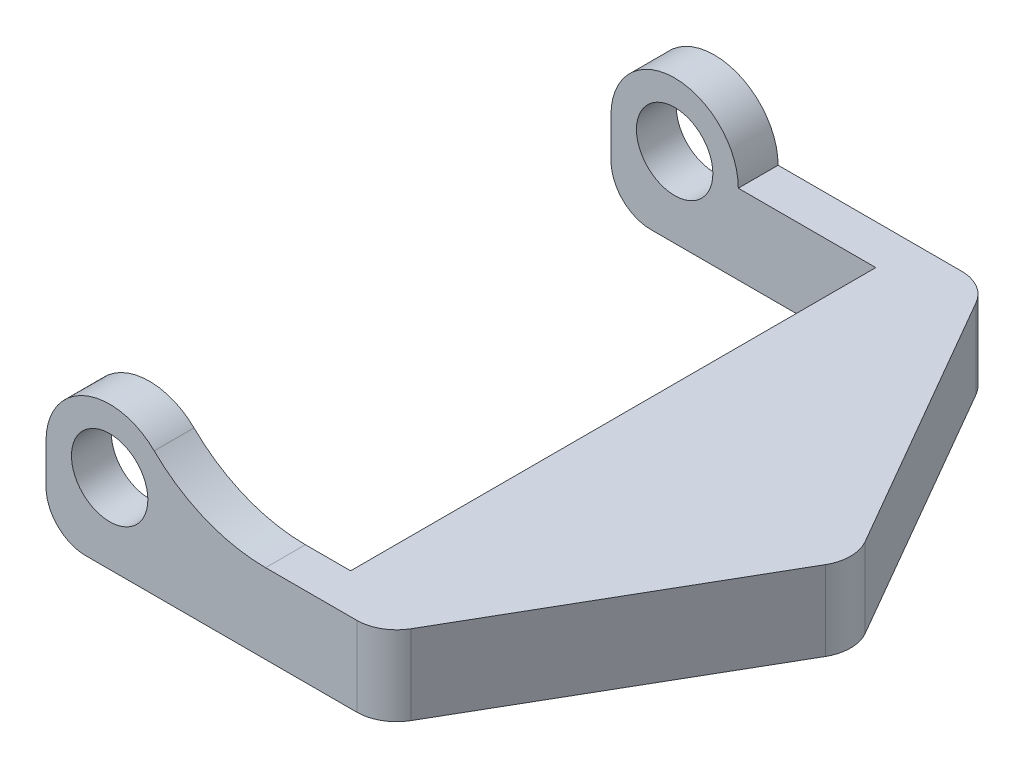
ISO-10303-21;
HEADER;
FILE_DESCRIPTION(('STEP AP214'),'2;1');
FILE_NAME('part.step','',(''),(''),'','','');
FILE_SCHEMA(('AUTOMOTIVE_DESIGN { 1 0 10303 214 1 1 1 1 }'));
ENDSEC;
DATA;
#1=APPLICATION_CONTEXT('core data for automotive mechanical design processes');
#2=APPLICATION_PROTOCOL_DEFINITION('international standard','automotive_design',2000,#1);
#3=PRODUCT_CONTEXT('',#1,'mechanical');
#4=PRODUCT('Part','Part','',(#3));
#5=PRODUCT_RELATED_PRODUCT_CATEGORY('part','',(#4));
#6=PRODUCT_DEFINITION_FORMATION('','',#4);
#7=PRODUCT_DEFINITION_CONTEXT('part definition',#1,'design');
#8=PRODUCT_DEFINITION('design','',#6,#7);
#9=PRODUCT_DEFINITION_SHAPE('','',#8);
#10=(LENGTH_UNIT() NAMED_UNIT(*) SI_UNIT(.MILLI.,.METRE.));
#11=(NAMED_UNIT(*) PLANE_ANGLE_UNIT() SI_UNIT($,.RADIAN.));
#12=(NAMED_UNIT(*) SI_UNIT($,.STERADIAN.) SOLID_ANGLE_UNIT());
#13=UNCERTAINTY_MEASURE_WITH_UNIT(LENGTH_MEASURE(1.E-05),#10,'distance_accuracy_value','');
#14=(GEOMETRIC_REPRESENTATION_CONTEXT(3) GLOBAL_UNCERTAINTY_ASSIGNED_CONTEXT((#13)) GLOBAL_UNIT_ASSIGNED_CONTEXT((#10,
#11,#12)) REPRESENTATION_CONTEXT('',''));
#15=CARTESIAN_POINT('',(0.,0.,0.));
#16=DIRECTION('',(0.,0.,1.));
#17=DIRECTION('',(1.,0.,0.));
#18=AXIS2_PLACEMENT_3D('',#15,#16,#17);
#19=CARTESIAN_POINT('',(0.,5.,0.));
#20=DIRECTION('',(0.,-1.,0.));
#21=DIRECTION('',(0.,0.,-1.));
#22=AXIS2_PLACEMENT_3D('',#19,#20,#21);
#23=PLANE('',#22);
#24=DIRECTION('',(-0.5,0.,-0.866025403784438));
#25=VECTOR('',#24,1.);
#26=CARTESIAN_POINT('',(10.9696551146029,5.,-19.));
#27=LINE('',#26,#25);
#28=CARTESIAN_POINT('',(21.2176223927188,5.,-1.25));
#29=VERTEX_POINT('',#28);
#30=CARTESIAN_POINT('',(11.6913429510899,5.,-17.75));
#31=VERTEX_POINT('',#30);
#32=EDGE_CURVE('E238',#29,#31,#27,.T.);
#33=ORIENTED_EDGE('',*,*,#32,.T.);
#34=CARTESIAN_POINT('',(9.52627944162883,5.,-16.5));
#35=DIRECTION('',(0.,-1.,0.));
#36=DIRECTION('',(0.,0.,-1.));
#37=AXIS2_PLACEMENT_3D('',#34,#35,#36);
#38=CIRCLE('',#37,2.5);
#39=CARTESIAN_POINT('',(9.52627944162883,5.,-19.));
#40=VERTEX_POINT('',#39);
#41=EDGE_CURVE('E346',#31,#40,#38,.F.);
#42=ORIENTED_EDGE('',*,*,#41,.T.);
#43=DIRECTION('',(-1.,0.,0.));
#44=VECTOR('',#43,1.);
#45=CARTESIAN_POINT('',(0.,5.,-19.));
#46=LINE('',#45,#44);
#47=CARTESIAN_POINT('',(-1.99999999999999,5.,-19.));
#48=VERTEX_POINT('',#47);
#49=EDGE_CURVE('E180',#40,#48,#46,.T.);
#50=ORIENTED_EDGE('',*,*,#49,.T.);
#51=DIRECTION('',(0.,0.,-1.));
#52=VECTOR('',#51,1.);
#53=CARTESIAN_POINT('',(-1.99999999999999,5.,-16.5));
#54=LINE('',#53,#52);
#55=CARTESIAN_POINT('',(-1.99999999999999,5.,-16.5));
#56=VERTEX_POINT('',#55);
#57=EDGE_CURVE('E195',#56,#48,#54,.T.);
#58=ORIENTED_EDGE('',*,*,#57,.F.);
#59=DIRECTION('',(1.,0.,0.));
#60=VECTOR('',#59,1.);
#61=CARTESIAN_POINT('',(6.6395280956807,5.,-16.5));
#62=LINE('',#61,#60);
#63=CARTESIAN_POINT('',(6.6395280956807,5.,-16.5));
#64=VERTEX_POINT('',#63);
#65=EDGE_CURVE('E179',#56,#64,#62,.T.);
#66=ORIENTED_EDGE('',*,*,#65,.T.);
#67=DIRECTION('',(0.,0.,1.));
#68=VECTOR('',#67,1.);
#69=CARTESIAN_POINT('',(6.6395280956807,5.,-16.5));
#70=LINE('',#69,#68);
#71=CARTESIAN_POINT('',(6.6395280956807,5.,16.5));
#72=VERTEX_POINT('',#71);
#73=EDGE_CURVE('E221',#64,#72,#70,.T.);
#74=ORIENTED_EDGE('',*,*,#73,.T.);
#75=DIRECTION('',(-1.,0.,0.));
#76=VECTOR('',#75,1.);
#77=CARTESIAN_POINT('',(6.6395280956807,5.,16.5));
#78=LINE('',#77,#76);
#79=CARTESIAN_POINT('',(3.79795897113272,5.,16.5));
#80=VERTEX_POINT('',#79);
#81=EDGE_CURVE('E224',#72,#80,#78,.T.);
#82=ORIENTED_EDGE('',*,*,#81,.T.);
#83=DIRECTION('',(0.,0.,1.));
#84=VECTOR('',#83,1.);
#85=CARTESIAN_POINT('',(3.79795897113272,5.,0.));
#86=LINE('',#85,#84);
#87=CARTESIAN_POINT('',(3.79795897113272,5.,19.));
#88=VERTEX_POINT('',#87);
#89=EDGE_CURVE('E191',#80,#88,#86,.T.);
#90=ORIENTED_EDGE('',*,*,#89,.T.);
#91=DIRECTION('',(1.,0.,0.));
#92=VECTOR('',#91,1.);
#93=CARTESIAN_POINT('',(-10.,5.,19.));
#94=LINE('',#93,#92);
#95=CARTESIAN_POINT('',(9.52627944162883,5.,19.));
#96=VERTEX_POINT('',#95);
#97=EDGE_CURVE('E232',#88,#96,#94,.T.);
#98=ORIENTED_EDGE('',*,*,#97,.T.);
#99=CARTESIAN_POINT('',(9.52627944162883,5.,16.5));
#100=DIRECTION('',(0.,-1.,0.));
#101=DIRECTION('',(0.,0.,-1.));
#102=AXIS2_PLACEMENT_3D('',#99,#100,#101);
#103=CIRCLE('',#102,2.5);
#104=CARTESIAN_POINT('',(11.6913429510899,5.,17.75));
#105=VERTEX_POINT('',#104);
#106=EDGE_CURVE('E67',#96,#105,#103,.F.);
#107=ORIENTED_EDGE('',*,*,#106,.T.);
#108=DIRECTION('',(0.5,0.,-0.866025403784438));
#109=VECTOR('',#108,1.);
#110=CARTESIAN_POINT('',(21.9393102292058,5.,0.));
#111=LINE('',#110,#109);
#112=CARTESIAN_POINT('',(21.2176223927188,5.,1.25));
#113=VERTEX_POINT('',#112);
#114=EDGE_CURVE('E235',#105,#113,#111,.T.);
#115=ORIENTED_EDGE('',*,*,#114,.T.);
#116=CARTESIAN_POINT('',(19.0525588832577,5.,0.));
#117=DIRECTION('',(0.,-1.,0.));
#118=DIRECTION('',(0.,0.,-1.));
#119=AXIS2_PLACEMENT_3D('',#116,#117,#118);
#120=CIRCLE('',#119,2.5);
#121=EDGE_CURVE('E341',#113,#29,#120,.F.);
#122=ORIENTED_EDGE('',*,*,#121,.T.);
#123=EDGE_LOOP('',(#33,#42,#50,#58,#66,#74,#82,#90,#98,#107,#115,#122));
#124=FACE_BOUND('',#123,.T.);
#125=ADVANCED_FACE('F45',(#124),#23,.F.);
#126=CARTESIAN_POINT('',(-10.,5.,-19.));
#127=DIRECTION('',(0.,0.,1.));
#128=DIRECTION('',(1.,0.,0.));
#129=AXIS2_PLACEMENT_3D('',#126,#127,#128);
#130=PLANE('',#129);
#131=CARTESIAN_POINT('',(-5.99999999999999,5.,-19.));
#132=DIRECTION('',(0.,0.,1.));
#133=DIRECTION('',(1.,0.,0.));
#134=AXIS2_PLACEMENT_3D('',#131,#132,#133);
#135=CIRCLE('',#134,2.39999999999999);
#136=CARTESIAN_POINT('',(-3.6,5.,-19.));
#137=VERTEX_POINT('',#136);
#138=EDGE_CURVE('E601',#137,#137,#135,.T.);
#139=ORIENTED_EDGE('',*,*,#138,.T.);
#140=EDGE_LOOP('',(#139));
#141=FACE_BOUND('',#140,.T.);
#142=DIRECTION('',(-1.,0.,0.));
#143=VECTOR('',#142,1.);
#144=CARTESIAN_POINT('',(-10.,0.,-19.));
#145=LINE('',#144,#143);
#146=CARTESIAN_POINT('',(9.52627944162883,0.,-19.));
#147=VERTEX_POINT('',#146);
#148=CARTESIAN_POINT('',(-7.5,0.,-19.));
#149=VERTEX_POINT('',#148);
#150=EDGE_CURVE('E213',#147,#149,#145,.T.);
#151=ORIENTED_EDGE('',*,*,#150,.T.);
#152=CARTESIAN_POINT('',(-7.5,2.5,-19.));
#153=DIRECTION('',(0.,0.,1.));
#154=DIRECTION('',(1.,0.,0.));
#155=AXIS2_PLACEMENT_3D('',#152,#153,#154);
#156=CIRCLE('',#155,2.5);
#157=CARTESIAN_POINT('',(-10.,2.5,-19.));
#158=VERTEX_POINT('',#157);
#159=EDGE_CURVE('E189',#149,#158,#156,.F.);
#160=ORIENTED_EDGE('',*,*,#159,.T.);
#161=DIRECTION('',(0.,-1.,0.));
#162=VECTOR('',#161,1.);
#163=CARTESIAN_POINT('',(-10.,5.,-19.));
#164=LINE('',#163,#162);
#165=CARTESIAN_POINT('',(-9.99999999999999,5.,-19.));
#166=VERTEX_POINT('',#165);
#167=EDGE_CURVE('E170',#166,#158,#164,.T.);
#168=ORIENTED_EDGE('',*,*,#167,.F.);
#169=CARTESIAN_POINT('',(-5.99999999999999,5.,-19.));
#170=DIRECTION('',(0.,0.,1.));
#171=DIRECTION('',(1.,0.,0.));
#172=AXIS2_PLACEMENT_3D('',#169,#170,#171);
#173=CIRCLE('',#172,4.);
#174=EDGE_CURVE('E187',#48,#166,#173,.T.);
#175=ORIENTED_EDGE('',*,*,#174,.F.);
#176=ORIENTED_EDGE('',*,*,#49,.F.);
#177=DIRECTION('',(0.,-1.,0.));
#178=VECTOR('',#177,1.);
#179=CARTESIAN_POINT('',(9.52627944162883,5.,-19.));
#180=LINE('',#179,#178);
#181=EDGE_CURVE('E315',#40,#147,#180,.T.);
#182=ORIENTED_EDGE('',*,*,#181,.T.);
#183=EDGE_LOOP('',(#151,#160,#168,#175,#176,#182));
#184=FACE_BOUND('',#183,.T.);
#185=ADVANCED_FACE('F185',(#141,#184),#130,.F.);
#186=CARTESIAN_POINT('',(-10.,5.,-16.5));
#187=DIRECTION('',(1.,0.,0.));
#188=DIRECTION('',(0.,0.,-1.));
#189=AXIS2_PLACEMENT_3D('',#186,#187,#188);
#190=PLANE('',#189);
#191=ORIENTED_EDGE('',*,*,#167,.T.);
#192=DIRECTION('',(0.,0.,1.));
#193=VECTOR('',#192,1.);
#194=CARTESIAN_POINT('',(-10.,2.5,-16.5));
#195=LINE('',#194,#193);
#196=CARTESIAN_POINT('',(-10.,2.5,-16.5));
#197=VERTEX_POINT('',#196);
#198=EDGE_CURVE('E294',#158,#197,#195,.T.);
#199=ORIENTED_EDGE('',*,*,#198,.T.);
#200=DIRECTION('',(0.,-1.,0.));
#201=VECTOR('',#200,1.);
#202=CARTESIAN_POINT('',(-10.,5.,-16.5));
#203=LINE('',#202,#201);
#204=CARTESIAN_POINT('',(-10.,5.,-16.5));
#205=VERTEX_POINT('',#204);
#206=EDGE_CURVE('E173',#205,#197,#203,.T.);
#207=ORIENTED_EDGE('',*,*,#206,.F.);
#208=DIRECTION('',(0.,0.,1.));
#209=VECTOR('',#208,1.);
#210=CARTESIAN_POINT('',(-10.,5.,-16.5));
#211=LINE('',#210,#209);
#212=EDGE_CURVE('E166',#166,#205,#211,.T.);
#213=ORIENTED_EDGE('',*,*,#212,.F.);
#214=EDGE_LOOP('',(#191,#199,#207,#213));
#215=FACE_BOUND('',#214,.T.);
#216=ADVANCED_FACE('F168',(#215),#190,.F.);
#217=CARTESIAN_POINT('',(6.6395280956807,5.,-16.5));
#218=DIRECTION('',(0.,0.,-1.));
#219=DIRECTION('',(-1.,0.,0.));
#220=AXIS2_PLACEMENT_3D('',#217,#218,#219);
#221=PLANE('',#220);
#222=CARTESIAN_POINT('',(-5.99999999999999,5.,-16.5));
#223=DIRECTION('',(0.,0.,-1.));
#224=DIRECTION('',(-1.,0.,0.));
#225=AXIS2_PLACEMENT_3D('',#222,#223,#224);
#226=CIRCLE('',#225,2.39999999999999);
#227=CARTESIAN_POINT('',(-8.39999999999998,5.,-16.5));
#228=VERTEX_POINT('',#227);
#229=EDGE_CURVE('E198',#228,#228,#226,.T.);
#230=ORIENTED_EDGE('',*,*,#229,.T.);
#231=EDGE_LOOP('',(#230));
#232=FACE_BOUND('',#231,.T.);
#233=ORIENTED_EDGE('',*,*,#206,.T.);
#234=CARTESIAN_POINT('',(-7.5,2.5,-16.5));
#235=DIRECTION('',(0.,0.,-1.));
#236=DIRECTION('',(-1.,0.,0.));
#237=AXIS2_PLACEMENT_3D('',#234,#235,#236);
#238=CIRCLE('',#237,2.5);
#239=CARTESIAN_POINT('',(-7.5,0.,-16.5));
#240=VERTEX_POINT('',#239);
#241=EDGE_CURVE('E297',#197,#240,#238,.F.);
#242=ORIENTED_EDGE('',*,*,#241,.T.);
#243=DIRECTION('',(1.,0.,0.));
#244=VECTOR('',#243,1.);
#245=CARTESIAN_POINT('',(6.6395280956807,0.,-16.5));
#246=LINE('',#245,#244);
#247=CARTESIAN_POINT('',(6.6395280956807,0.,-16.5));
#248=VERTEX_POINT('',#247);
#249=EDGE_CURVE('E245',#240,#248,#246,.T.);
#250=ORIENTED_EDGE('',*,*,#249,.T.);
#251=DIRECTION('',(0.,-1.,0.));
#252=VECTOR('',#251,1.);
#253=CARTESIAN_POINT('',(6.6395280956807,5.,-16.5));
#254=LINE('',#253,#252);
#255=EDGE_CURVE('E276',#64,#248,#254,.T.);
#256=ORIENTED_EDGE('',*,*,#255,.F.);
#257=ORIENTED_EDGE('',*,*,#65,.F.);
#258=CARTESIAN_POINT('',(-5.99999999999999,5.,-16.5));
#259=DIRECTION('',(0.,0.,1.));
#260=DIRECTION('',(1.,0.,0.));
#261=AXIS2_PLACEMENT_3D('',#258,#259,#260);
#262=CIRCLE('',#261,4.);
#263=EDGE_CURVE('E197',#56,#205,#262,.T.);
#264=ORIENTED_EDGE('',*,*,#263,.T.);
#265=EDGE_LOOP('',(#233,#242,#250,#256,#257,#264));
#266=FACE_BOUND('',#265,.T.);
#267=ADVANCED_FACE('F400',(#232,#266),#221,.F.);
#268=CARTESIAN_POINT('',(6.6395280956807,5.,-16.5));
#269=DIRECTION('',(1.,0.,0.));
#270=DIRECTION('',(0.,0.,-1.));
#271=AXIS2_PLACEMENT_3D('',#268,#269,#270);
#272=PLANE('',#271);
#273=DIRECTION('',(0.,0.,1.));
#274=VECTOR('',#273,1.);
#275=CARTESIAN_POINT('',(6.6395280956807,0.,-16.5));
#276=LINE('',#275,#274);
#277=CARTESIAN_POINT('',(6.6395280956807,0.,16.5));
#278=VERTEX_POINT('',#277);
#279=EDGE_CURVE('E248',#248,#278,#276,.T.);
#280=ORIENTED_EDGE('',*,*,#279,.T.);
#281=DIRECTION('',(0.,-1.,0.));
#282=VECTOR('',#281,1.);
#283=CARTESIAN_POINT('',(6.6395280956807,5.,16.5));
#284=LINE('',#283,#282);
#285=EDGE_CURVE('E272',#72,#278,#284,.T.);
#286=ORIENTED_EDGE('',*,*,#285,.F.);
#287=ORIENTED_EDGE('',*,*,#73,.F.);
#288=ORIENTED_EDGE('',*,*,#255,.T.);
#289=EDGE_LOOP('',(#280,#286,#287,#288));
#290=FACE_BOUND('',#289,.T.);
#291=ADVANCED_FACE('F395',(#290),#272,.F.);
#292=CARTESIAN_POINT('',(6.6395280956807,5.,16.5));
#293=DIRECTION('',(0.,0.,1.));
#294=DIRECTION('',(1.,0.,0.));
#295=AXIS2_PLACEMENT_3D('',#292,#293,#294);
#296=PLANE('',#295);
#297=CARTESIAN_POINT('',(-5.99999999999999,5.,16.5));
#298=DIRECTION('',(0.,0.,1.));
#299=DIRECTION('',(1.,0.,0.));
#300=AXIS2_PLACEMENT_3D('',#297,#298,#299);
#301=CIRCLE('',#300,2.39999999999999);
#302=CARTESIAN_POINT('',(-3.6,5.,16.5));
#303=VERTEX_POINT('',#302);
#304=EDGE_CURVE('E204',#303,#303,#301,.T.);
#305=ORIENTED_EDGE('',*,*,#304,.T.);
#306=EDGE_LOOP('',(#305));
#307=FACE_BOUND('',#306,.T.);
#308=DIRECTION('',(-1.,0.,0.));
#309=VECTOR('',#308,1.);
#310=CARTESIAN_POINT('',(6.6395280956807,0.,16.5));
#311=LINE('',#310,#309);
#312=CARTESIAN_POINT('',(-7.5,0.,16.5));
#313=VERTEX_POINT('',#312);
#314=EDGE_CURVE('E251',#278,#313,#311,.T.);
#315=ORIENTED_EDGE('',*,*,#314,.T.);
#316=CARTESIAN_POINT('',(-7.5,2.5,16.5));
#317=DIRECTION('',(0.,0.,1.));
#318=DIRECTION('',(1.,0.,0.));
#319=AXIS2_PLACEMENT_3D('',#316,#317,#318);
#320=CIRCLE('',#319,2.5);
#321=CARTESIAN_POINT('',(-10.,2.5,16.5));
#322=VERTEX_POINT('',#321);
#323=EDGE_CURVE('E331',#313,#322,#320,.F.);
#324=ORIENTED_EDGE('',*,*,#323,.T.);
#325=DIRECTION('',(0.,-1.,0.));
#326=VECTOR('',#325,1.);
#327=CARTESIAN_POINT('',(-10.,5.,16.5));
#328=LINE('',#327,#326);
#329=CARTESIAN_POINT('',(-10.,5.,16.5));
#330=VERTEX_POINT('',#329);
#331=EDGE_CURVE('E268',#330,#322,#328,.T.);
#332=ORIENTED_EDGE('',*,*,#331,.F.);
#333=CARTESIAN_POINT('',(-5.99999999999999,5.,16.5));
#334=DIRECTION('',(0.,0.,1.));
#335=DIRECTION('',(1.,0.,0.));
#336=AXIS2_PLACEMENT_3D('',#333,#334,#335);
#337=CIRCLE('',#336,4.);
#338=CARTESIAN_POINT('',(-3.20058315110493,7.85714285714286,16.5));
#339=VERTEX_POINT('',#338);
#340=EDGE_CURVE('E210',#339,#330,#337,.T.);
#341=ORIENTED_EDGE('',*,*,#340,.F.);
#342=CARTESIAN_POINT('',(3.79795897113272,15.,16.5));
#343=DIRECTION('',(0.,0.,1.));
#344=DIRECTION('',(1.,0.,0.));
#345=AXIS2_PLACEMENT_3D('',#342,#343,#344);
#346=CIRCLE('',#345,10.);
#347=EDGE_CURVE('E291',#339,#80,#346,.T.);
#348=ORIENTED_EDGE('',*,*,#347,.T.);
#349=ORIENTED_EDGE('',*,*,#81,.F.);
#350=ORIENTED_EDGE('',*,*,#285,.T.);
#351=EDGE_LOOP('',(#315,#324,#332,#341,#348,#349,#350));
#352=FACE_BOUND('',#351,.T.);
#353=ADVANCED_FACE('F387',(#307,#352),#296,.F.);
#354=CARTESIAN_POINT('',(-10.,5.,16.5));
#355=DIRECTION('',(1.,0.,0.));
#356=DIRECTION('',(0.,0.,-1.));
#357=AXIS2_PLACEMENT_3D('',#354,#355,#356);
#358=PLANE('',#357);
#359=ORIENTED_EDGE('',*,*,#331,.T.);
#360=DIRECTION('',(0.,0.,1.));
#361=VECTOR('',#360,1.);
#362=CARTESIAN_POINT('',(-10.,2.5,19.));
#363=LINE('',#362,#361);
#364=CARTESIAN_POINT('',(-10.,2.5,19.));
#365=VERTEX_POINT('',#364);
#366=EDGE_CURVE('E321',#322,#365,#363,.T.);
#367=ORIENTED_EDGE('',*,*,#366,.T.);
#368=DIRECTION('',(0.,-1.,0.));
#369=VECTOR('',#368,1.);
#370=CARTESIAN_POINT('',(-10.,5.,19.));
#371=LINE('',#370,#369);
#372=CARTESIAN_POINT('',(-10.,5.,19.));
#373=VERTEX_POINT('',#372);
#374=EDGE_CURVE('E242',#373,#365,#371,.T.);
#375=ORIENTED_EDGE('',*,*,#374,.F.);
#376=DIRECTION('',(0.,0.,1.));
#377=VECTOR('',#376,1.);
#378=CARTESIAN_POINT('',(-10.,5.,16.5));
#379=LINE('',#378,#377);
#380=EDGE_CURVE('E228',#330,#373,#379,.T.);
#381=ORIENTED_EDGE('',*,*,#380,.F.);
#382=EDGE_LOOP('',(#359,#367,#375,#381));
#383=FACE_BOUND('',#382,.T.);
#384=ADVANCED_FACE('F382',(#383),#358,.F.);
#385=CARTESIAN_POINT('',(0.,5.,19.));
#386=DIRECTION('',(0.,0.,-1.));
#387=DIRECTION('',(-1.,0.,0.));
#388=AXIS2_PLACEMENT_3D('',#385,#386,#387);
#389=PLANE('',#388);
#390=CARTESIAN_POINT('',(-5.99999999999999,5.,19.));
#391=DIRECTION('',(0.,0.,1.));
#392=DIRECTION('',(1.,0.,0.));
#393=AXIS2_PLACEMENT_3D('',#390,#391,#392);
#394=CIRCLE('',#393,2.39999999999999);
#395=CARTESIAN_POINT('',(-3.6,5.,19.));
#396=VERTEX_POINT('',#395);
#397=EDGE_CURVE('E604',#396,#396,#394,.T.);
#398=ORIENTED_EDGE('',*,*,#397,.F.);
#399=EDGE_LOOP('',(#398));
#400=FACE_BOUND('',#399,.T.);
#401=ORIENTED_EDGE('',*,*,#374,.T.);
#402=CARTESIAN_POINT('',(-7.5,2.5,19.));
#403=DIRECTION('',(0.,0.,-1.));
#404=DIRECTION('',(-1.,0.,0.));
#405=AXIS2_PLACEMENT_3D('',#402,#403,#404);
#406=CIRCLE('',#405,2.5);
#407=CARTESIAN_POINT('',(-7.5,0.,19.));
#408=VERTEX_POINT('',#407);
#409=EDGE_CURVE('E328',#365,#408,#406,.F.);
#410=ORIENTED_EDGE('',*,*,#409,.T.);
#411=DIRECTION('',(1.,0.,0.));
#412=VECTOR('',#411,1.);
#413=CARTESIAN_POINT('',(0.,0.,19.));
#414=LINE('',#413,#412);
#415=CARTESIAN_POINT('',(9.52627944162883,0.,19.));
#416=VERTEX_POINT('',#415);
#417=EDGE_CURVE('E255',#408,#416,#414,.T.);
#418=ORIENTED_EDGE('',*,*,#417,.T.);
#419=DIRECTION('',(0.,-1.,0.));
#420=VECTOR('',#419,1.);
#421=CARTESIAN_POINT('',(9.52627944162883,5.,19.));
#422=LINE('',#421,#420);
#423=EDGE_CURVE('E325',#416,#96,#422,.F.);
#424=ORIENTED_EDGE('',*,*,#423,.T.);
#425=ORIENTED_EDGE('',*,*,#97,.F.);
#426=CARTESIAN_POINT('',(3.79795897113272,15.,19.));
#427=DIRECTION('',(0.,0.,-1.));
#428=DIRECTION('',(-1.,0.,0.));
#429=AXIS2_PLACEMENT_3D('',#426,#427,#428);
#430=CIRCLE('',#429,10.);
#431=CARTESIAN_POINT('',(-3.20058315110493,7.85714285714286,19.));
#432=VERTEX_POINT('',#431);
#433=EDGE_CURVE('E288',#88,#432,#430,.T.);
#434=ORIENTED_EDGE('',*,*,#433,.T.);
#435=CARTESIAN_POINT('',(-5.99999999999999,5.,19.));
#436=DIRECTION('',(0.,0.,1.));
#437=DIRECTION('',(1.,0.,0.));
#438=AXIS2_PLACEMENT_3D('',#435,#436,#437);
#439=CIRCLE('',#438,4.);
#440=EDGE_CURVE('E209',#432,#373,#439,.T.);
#441=ORIENTED_EDGE('',*,*,#440,.T.);
#442=EDGE_LOOP('',(#401,#410,#418,#424,#425,#434,#441));
#443=FACE_BOUND('',#442,.T.);
#444=ADVANCED_FACE('F374',(#400,#443),#389,.F.);
#445=CARTESIAN_POINT('',(21.9393102292058,5.,0.));
#446=DIRECTION('',(-0.866025403784438,0.,-0.5));
#447=DIRECTION('',(-0.5,0.,0.866025403784438));
#448=AXIS2_PLACEMENT_3D('',#445,#446,#447);
#449=PLANE('',#448);
#450=ORIENTED_EDGE('',*,*,#114,.F.);
#451=DIRECTION('',(0.,-1.,0.));
#452=VECTOR('',#451,1.);
#453=CARTESIAN_POINT('',(11.6913429510899,5.,17.75));
#454=LINE('',#453,#452);
#455=CARTESIAN_POINT('',(11.6913429510899,0.,17.75));
#456=VERTEX_POINT('',#455);
#457=EDGE_CURVE('E11',#105,#456,#454,.T.);
#458=ORIENTED_EDGE('',*,*,#457,.T.);
#459=DIRECTION('',(0.5,0.,-0.866025403784438));
#460=VECTOR('',#459,1.);
#461=CARTESIAN_POINT('',(21.9393102292058,0.,0.));
#462=LINE('',#461,#460);
#463=CARTESIAN_POINT('',(21.2176223927188,0.,1.25));
#464=VERTEX_POINT('',#463);
#465=EDGE_CURVE('E259',#456,#464,#462,.T.);
#466=ORIENTED_EDGE('',*,*,#465,.T.);
#467=DIRECTION('',(0.,-1.,0.));
#468=VECTOR('',#467,1.);
#469=CARTESIAN_POINT('',(21.2176223927188,5.,1.25));
#470=LINE('',#469,#468);
#471=EDGE_CURVE('E54',#464,#113,#470,.F.);
#472=ORIENTED_EDGE('',*,*,#471,.T.);
#473=EDGE_LOOP('',(#450,#458,#466,#472));
#474=FACE_BOUND('',#473,.T.);
#475=ADVANCED_FACE('F366',(#474),#449,.F.);
#476=CARTESIAN_POINT('',(10.9696551146029,5.,-19.));
#477=DIRECTION('',(-0.866025403784438,0.,0.5));
#478=DIRECTION('',(0.500000000000001,0.,0.866025403784438));
#479=AXIS2_PLACEMENT_3D('',#476,#477,#478);
#480=PLANE('',#479);
#481=DIRECTION('',(-0.5,0.,-0.866025403784438));
#482=VECTOR('',#481,1.);
#483=CARTESIAN_POINT('',(10.9696551146029,0.,-19.));
#484=LINE('',#483,#482);
#485=CARTESIAN_POINT('',(21.2176223927188,0.,-1.25));
#486=VERTEX_POINT('',#485);
#487=CARTESIAN_POINT('',(11.6913429510899,0.,-17.75));
#488=VERTEX_POINT('',#487);
#489=EDGE_CURVE('E217',#486,#488,#484,.T.);
#490=ORIENTED_EDGE('',*,*,#489,.T.);
#491=DIRECTION('',(0.,-1.,0.));
#492=VECTOR('',#491,1.);
#493=CARTESIAN_POINT('',(11.6913429510899,5.,-17.75));
#494=LINE('',#493,#492);
#495=EDGE_CURVE('E338',#488,#31,#494,.F.);
#496=ORIENTED_EDGE('',*,*,#495,.T.);
#497=ORIENTED_EDGE('',*,*,#32,.F.);
#498=DIRECTION('',(0.,-1.,0.));
#499=VECTOR('',#498,1.);
#500=CARTESIAN_POINT('',(21.2176223927188,5.,-1.25));
#501=LINE('',#500,#499);
#502=EDGE_CURVE('E334',#29,#486,#501,.T.);
#503=ORIENTED_EDGE('',*,*,#502,.T.);
#504=EDGE_LOOP('',(#490,#496,#497,#503));
#505=FACE_BOUND('',#504,.T.);
#506=ADVANCED_FACE('F361',(#505),#480,.F.);
#507=CARTESIAN_POINT('',(0.,0.,0.));
#508=DIRECTION('',(0.,-1.,0.));
#509=DIRECTION('',(0.,0.,-1.));
#510=AXIS2_PLACEMENT_3D('',#507,#508,#509);
#511=PLANE('',#510);
#512=ORIENTED_EDGE('',*,*,#249,.F.);
#513=DIRECTION('',(0.,0.,1.));
#514=VECTOR('',#513,1.);
#515=CARTESIAN_POINT('',(-7.5,0.,-19.));
#516=LINE('',#515,#514);
#517=EDGE_CURVE('E312',#240,#149,#516,.F.);
#518=ORIENTED_EDGE('',*,*,#517,.T.);
#519=ORIENTED_EDGE('',*,*,#150,.F.);
#520=CARTESIAN_POINT('',(9.52627944162883,0.,-16.5));
#521=DIRECTION('',(0.,-1.,0.));
#522=DIRECTION('',(0.,0.,-1.));
#523=AXIS2_PLACEMENT_3D('',#520,#521,#522);
#524=CIRCLE('',#523,2.5);
#525=EDGE_CURVE('E306',#147,#488,#524,.T.);
#526=ORIENTED_EDGE('',*,*,#525,.T.);
#527=ORIENTED_EDGE('',*,*,#489,.F.);
#528=CARTESIAN_POINT('',(19.0525588832577,0.,0.));
#529=DIRECTION('',(0.,-1.,0.));
#530=DIRECTION('',(0.,0.,-1.));
#531=AXIS2_PLACEMENT_3D('',#528,#529,#530);
#532=CIRCLE('',#531,2.5);
#533=EDGE_CURVE('E300',#486,#464,#532,.T.);
#534=ORIENTED_EDGE('',*,*,#533,.T.);
#535=ORIENTED_EDGE('',*,*,#465,.F.);
#536=CARTESIAN_POINT('',(9.52627944162883,0.,16.5));
#537=DIRECTION('',(0.,-1.,0.));
#538=DIRECTION('',(0.,0.,-1.));
#539=AXIS2_PLACEMENT_3D('',#536,#537,#538);
#540=CIRCLE('',#539,2.5);
#541=EDGE_CURVE('E303',#456,#416,#540,.T.);
#542=ORIENTED_EDGE('',*,*,#541,.T.);
#543=ORIENTED_EDGE('',*,*,#417,.F.);
#544=DIRECTION('',(0.,0.,1.));
#545=VECTOR('',#544,1.);
#546=CARTESIAN_POINT('',(-7.5,0.,16.5));
#547=LINE('',#546,#545);
#548=EDGE_CURVE('E309',#408,#313,#547,.F.);
#549=ORIENTED_EDGE('',*,*,#548,.T.);
#550=ORIENTED_EDGE('',*,*,#314,.F.);
#551=ORIENTED_EDGE('',*,*,#279,.F.);
#552=EDGE_LOOP('',(#512,#518,#519,#526,#527,#534,#535,#542,#543,#549,#550,#551));
#553=FACE_BOUND('',#552,.T.);
#554=ADVANCED_FACE('F359',(#553),#511,.T.);
#555=CARTESIAN_POINT('',(-5.99999999999999,5.,16.5));
#556=DIRECTION('',(0.,0.,1.));
#557=DIRECTION('',(1.,0.,0.));
#558=AXIS2_PLACEMENT_3D('',#555,#556,#557);
#559=CYLINDRICAL_SURFACE('',#558,4.);
#560=ORIENTED_EDGE('',*,*,#440,.F.);
#561=DIRECTION('',(0.,0.,1.));
#562=VECTOR('',#561,1.);
#563=CARTESIAN_POINT('',(-3.20058315110493,7.85714285714286,16.5));
#564=LINE('',#563,#562);
#565=EDGE_CURVE('E285',#432,#339,#564,.F.);
#566=ORIENTED_EDGE('',*,*,#565,.T.);
#567=ORIENTED_EDGE('',*,*,#340,.T.);
#568=ORIENTED_EDGE('',*,*,#380,.T.);
#569=EDGE_LOOP('',(#560,#566,#567,#568));
#570=FACE_BOUND('',#569,.T.);
#571=ADVANCED_FACE('F424',(#570),#559,.T.);
#572=CARTESIAN_POINT('',(-5.99999999999999,5.,-16.5));
#573=DIRECTION('',(0.,0.,-1.));
#574=DIRECTION('',(-1.,0.,0.));
#575=AXIS2_PLACEMENT_3D('',#572,#573,#574);
#576=CYLINDRICAL_SURFACE('',#575,4.);
#577=ORIENTED_EDGE('',*,*,#174,.T.);
#578=ORIENTED_EDGE('',*,*,#212,.T.);
#579=ORIENTED_EDGE('',*,*,#263,.F.);
#580=ORIENTED_EDGE('',*,*,#57,.T.);
#581=EDGE_LOOP('',(#577,#578,#579,#580));
#582=FACE_BOUND('',#581,.T.);
#583=ADVANCED_FACE('F194',(#582),#576,.T.);
#584=CARTESIAN_POINT('',(-5.99999999999999,5.,19.));
#585=DIRECTION('',(0.,0.,1.));
#586=DIRECTION('',(1.,0.,0.));
#587=AXIS2_PLACEMENT_3D('',#584,#585,#586);
#588=CYLINDRICAL_SURFACE('',#587,2.39999999999999);
#589=ORIENTED_EDGE('',*,*,#397,.T.);
#590=EDGE_LOOP('',(#589));
#591=FACE_BOUND('',#590,.T.);
#592=ORIENTED_EDGE('',*,*,#304,.F.);
#593=EDGE_LOOP('',(#592));
#594=FACE_BOUND('',#593,.T.);
#595=ADVANCED_FACE('F507',(#591,#594),#588,.F.);
#596=ORIENTED_EDGE('',*,*,#138,.F.);
#597=EDGE_LOOP('',(#596));
#598=FACE_BOUND('',#597,.T.);
#599=ORIENTED_EDGE('',*,*,#229,.F.);
#600=EDGE_LOOP('',(#599));
#601=FACE_BOUND('',#600,.T.);
#602=ADVANCED_FACE('F412',(#598,#601),#588,.F.);
#603=CARTESIAN_POINT('',(3.79795897113272,15.,16.5));
#604=DIRECTION('',(0.,0.,1.));
#605=DIRECTION('',(1.,0.,0.));
#606=AXIS2_PLACEMENT_3D('',#603,#604,#605);
#607=CYLINDRICAL_SURFACE('',#606,10.);
#608=ORIENTED_EDGE('',*,*,#347,.F.);
#609=ORIENTED_EDGE('',*,*,#565,.F.);
#610=ORIENTED_EDGE('',*,*,#433,.F.);
#611=ORIENTED_EDGE('',*,*,#89,.F.);
#612=EDGE_LOOP('',(#608,#609,#610,#611));
#613=FACE_BOUND('',#612,.T.);
#614=ADVANCED_FACE('F404',(#613),#607,.F.);
#615=CARTESIAN_POINT('',(-7.5,2.5,-16.5));
#616=DIRECTION('',(0.,0.,-1.));
#617=DIRECTION('',(-1.,0.,0.));
#618=AXIS2_PLACEMENT_3D('',#615,#616,#617);
#619=CYLINDRICAL_SURFACE('',#618,2.5);
#620=ORIENTED_EDGE('',*,*,#159,.F.);
#621=ORIENTED_EDGE('',*,*,#517,.F.);
#622=ORIENTED_EDGE('',*,*,#241,.F.);
#623=ORIENTED_EDGE('',*,*,#198,.F.);
#624=EDGE_LOOP('',(#620,#621,#622,#623));
#625=FACE_BOUND('',#624,.T.);
#626=ADVANCED_FACE('F402',(#625),#619,.T.);
#627=CARTESIAN_POINT('',(-7.5,2.5,16.5));
#628=DIRECTION('',(0.,0.,-1.));
#629=DIRECTION('',(-1.,0.,0.));
#630=AXIS2_PLACEMENT_3D('',#627,#628,#629);
#631=CYLINDRICAL_SURFACE('',#630,2.5);
#632=ORIENTED_EDGE('',*,*,#323,.F.);
#633=ORIENTED_EDGE('',*,*,#548,.F.);
#634=ORIENTED_EDGE('',*,*,#409,.F.);
#635=ORIENTED_EDGE('',*,*,#366,.F.);
#636=EDGE_LOOP('',(#632,#633,#634,#635));
#637=FACE_BOUND('',#636,.T.);
#638=ADVANCED_FACE('F380',(#637),#631,.T.);
#639=CARTESIAN_POINT('',(9.52627944162883,5.,-16.5));
#640=DIRECTION('',(0.,-1.,0.));
#641=DIRECTION('',(0.,0.,-1.));
#642=AXIS2_PLACEMENT_3D('',#639,#640,#641);
#643=CYLINDRICAL_SURFACE('',#642,2.5);
#644=ORIENTED_EDGE('',*,*,#41,.F.);
#645=ORIENTED_EDGE('',*,*,#495,.F.);
#646=ORIENTED_EDGE('',*,*,#525,.F.);
#647=ORIENTED_EDGE('',*,*,#181,.F.);
#648=EDGE_LOOP('',(#644,#645,#646,#647));
#649=FACE_BOUND('',#648,.T.);
#650=ADVANCED_FACE('F355',(#649),#643,.T.);
#651=CARTESIAN_POINT('',(9.52627944162883,5.,16.5));
#652=DIRECTION('',(0.,-1.,0.));
#653=DIRECTION('',(0.,0.,-1.));
#654=AXIS2_PLACEMENT_3D('',#651,#652,#653);
#655=CYLINDRICAL_SURFACE('',#654,2.5);
#656=ORIENTED_EDGE('',*,*,#106,.F.);
#657=ORIENTED_EDGE('',*,*,#423,.F.);
#658=ORIENTED_EDGE('',*,*,#541,.F.);
#659=ORIENTED_EDGE('',*,*,#457,.F.);
#660=EDGE_LOOP('',(#656,#657,#658,#659));
#661=FACE_BOUND('',#660,.T.);
#662=ADVANCED_FACE('F369',(#661),#655,.T.);
#663=CARTESIAN_POINT('',(19.0525588832577,5.,0.));
#664=DIRECTION('',(0.,-1.,0.));
#665=DIRECTION('',(0.,0.,-1.));
#666=AXIS2_PLACEMENT_3D('',#663,#664,#665);
#667=CYLINDRICAL_SURFACE('',#666,2.5);
#668=ORIENTED_EDGE('',*,*,#121,.F.);
#669=ORIENTED_EDGE('',*,*,#471,.F.);
#670=ORIENTED_EDGE('',*,*,#533,.F.);
#671=ORIENTED_EDGE('',*,*,#502,.F.);
#672=EDGE_LOOP('',(#668,#669,#670,#671));
#673=FACE_BOUND('',#672,.T.);
#674=ADVANCED_FACE('F47',(#673),#667,.T.);
#675=CLOSED_SHELL('',(#125,#185,#216,#267,#291,#353,#384,#444,#475,#506,#554,#571,#583,#595,
#602,#614,#626,#638,#650,#662,#674));
#676=MANIFOLD_SOLID_BREP('B2',#675);
#677=ADVANCED_BREP_SHAPE_REPRESENTATION('',(#18,#676),#14);
#678=SHAPE_DEFINITION_REPRESENTATION(#9,#677);
ENDSEC;
END-ISO-10303-21;
